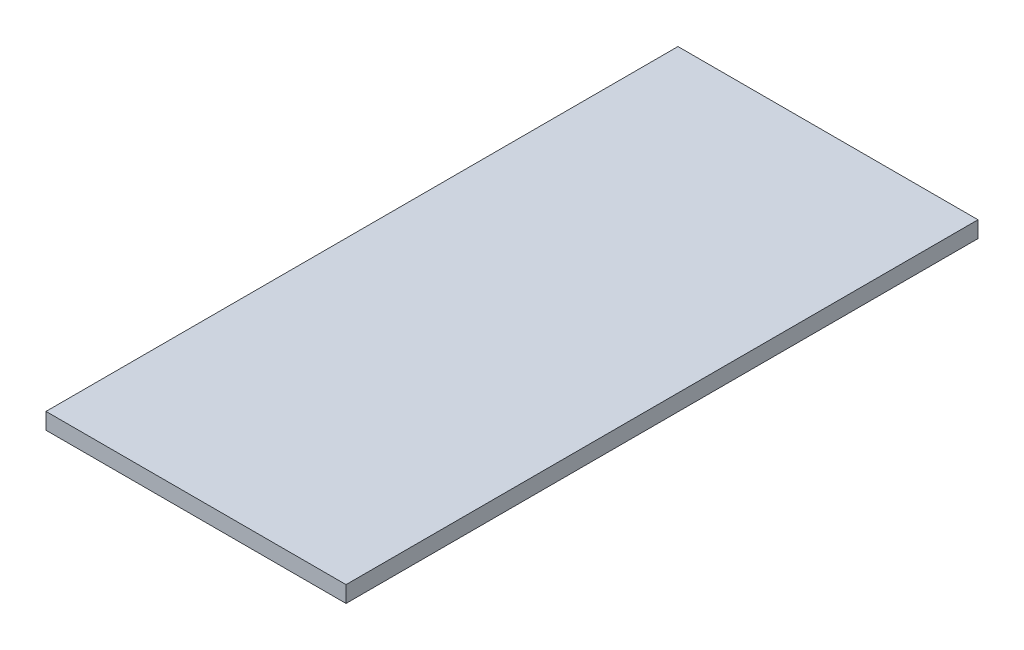
ISO-10303-21;
HEADER;
FILE_DESCRIPTION(('STEP AP214'),'2;1');
FILE_NAME('part.step','',(''),(''),'','','');
FILE_SCHEMA(('AUTOMOTIVE_DESIGN { 1 0 10303 214 1 1 1 1 }'));
ENDSEC;
DATA;
#1=APPLICATION_CONTEXT('core data for automotive mechanical design processes');
#2=APPLICATION_PROTOCOL_DEFINITION('international standard','automotive_design',2000,#1);
#3=PRODUCT_CONTEXT('',#1,'mechanical');
#4=PRODUCT('Part','Part','',(#3));
#5=PRODUCT_RELATED_PRODUCT_CATEGORY('part','',(#4));
#6=PRODUCT_DEFINITION_FORMATION('','',#4);
#7=PRODUCT_DEFINITION_CONTEXT('part definition',#1,'design');
#8=PRODUCT_DEFINITION('design','',#6,#7);
#9=PRODUCT_DEFINITION_SHAPE('','',#8);
#10=(LENGTH_UNIT() NAMED_UNIT(*) SI_UNIT(.MILLI.,.METRE.));
#11=(NAMED_UNIT(*) PLANE_ANGLE_UNIT() SI_UNIT($,.RADIAN.));
#12=(NAMED_UNIT(*) SI_UNIT($,.STERADIAN.) SOLID_ANGLE_UNIT());
#13=UNCERTAINTY_MEASURE_WITH_UNIT(LENGTH_MEASURE(1.E-05),#10,'distance_accuracy_value','');
#14=(GEOMETRIC_REPRESENTATION_CONTEXT(3) GLOBAL_UNCERTAINTY_ASSIGNED_CONTEXT((#13)) GLOBAL_UNIT_ASSIGNED_CONTEXT((#10,
#11,#12)) REPRESENTATION_CONTEXT('',''));
#15=CARTESIAN_POINT('',(0.,0.,0.));
#16=DIRECTION('',(0.,0.,1.));
#17=DIRECTION('',(1.,0.,0.));
#18=AXIS2_PLACEMENT_3D('',#15,#16,#17);
#19=CARTESIAN_POINT('',(1.4605,2.9956,-2.3241));
#20=DIRECTION('',(1.,0.,0.));
#21=DIRECTION('',(0.,-1.,0.));
#22=AXIS2_PLACEMENT_3D('',#19,#20,#21);
#23=PLANE('',#22);
#24=DIRECTION('',(0.,0.,1.));
#25=VECTOR('',#24,1.);
#26=CARTESIAN_POINT('',(1.4605,2.9306,-2.3241));
#27=LINE('',#26,#25);
#28=CARTESIAN_POINT('',(1.4605,2.9306,-4.8387));
#29=VERTEX_POINT('',#28);
#30=CARTESIAN_POINT('',(1.4605,2.9306,-2.3241));
#31=VERTEX_POINT('',#30);
#32=EDGE_CURVE('E11',#29,#31,#27,.T.);
#33=ORIENTED_EDGE('',*,*,#32,.T.);
#34=DIRECTION('',(0.,-1.,0.));
#35=VECTOR('',#34,1.);
#36=CARTESIAN_POINT('',(1.4605,2.9956,-2.3241));
#37=LINE('',#36,#35);
#38=CARTESIAN_POINT('',(1.4605,2.9956,-2.3241));
#39=VERTEX_POINT('',#38);
#40=EDGE_CURVE('E24',#39,#31,#37,.T.);
#41=ORIENTED_EDGE('',*,*,#40,.F.);
#42=DIRECTION('',(0.,0.,1.));
#43=VECTOR('',#42,1.);
#44=CARTESIAN_POINT('',(1.4605,2.9956,-2.3241));
#45=LINE('',#44,#43);
#46=CARTESIAN_POINT('',(1.4605,2.9956,-4.8387));
#47=VERTEX_POINT('',#46);
#48=EDGE_CURVE('E88',#47,#39,#45,.T.);
#49=ORIENTED_EDGE('',*,*,#48,.F.);
#50=DIRECTION('',(0.,-1.,0.));
#51=VECTOR('',#50,1.);
#52=CARTESIAN_POINT('',(1.4605,2.9956,-4.8387));
#53=LINE('',#52,#51);
#54=EDGE_CURVE('E77',#47,#29,#53,.T.);
#55=ORIENTED_EDGE('',*,*,#54,.T.);
#56=EDGE_LOOP('',(#33,#41,#49,#55));
#57=FACE_BOUND('',#56,.T.);
#58=ADVANCED_FACE('F17',(#57),#23,.F.);
#59=CARTESIAN_POINT('',(2.6543,2.9956,-2.3241));
#60=DIRECTION('',(0.,0.,-1.));
#61=DIRECTION('',(0.,1.,0.));
#62=AXIS2_PLACEMENT_3D('',#59,#60,#61);
#63=PLANE('',#62);
#64=DIRECTION('',(1.,0.,0.));
#65=VECTOR('',#64,1.);
#66=CARTESIAN_POINT('',(2.6543,2.9306,-2.3241));
#67=LINE('',#66,#65);
#68=CARTESIAN_POINT('',(2.6543,2.9306,-2.3241));
#69=VERTEX_POINT('',#68);
#70=EDGE_CURVE('E85',#31,#69,#67,.T.);
#71=ORIENTED_EDGE('',*,*,#70,.T.);
#72=DIRECTION('',(0.,-1.,0.));
#73=VECTOR('',#72,1.);
#74=CARTESIAN_POINT('',(2.6543,2.9956,-2.3241));
#75=LINE('',#74,#73);
#76=CARTESIAN_POINT('',(2.6543,2.9956,-2.3241));
#77=VERTEX_POINT('',#76);
#78=EDGE_CURVE('E83',#77,#69,#75,.T.);
#79=ORIENTED_EDGE('',*,*,#78,.F.);
#80=DIRECTION('',(1.,0.,0.));
#81=VECTOR('',#80,1.);
#82=CARTESIAN_POINT('',(2.6543,2.9956,-2.3241));
#83=LINE('',#82,#81);
#84=EDGE_CURVE('E72',#39,#77,#83,.T.);
#85=ORIENTED_EDGE('',*,*,#84,.F.);
#86=ORIENTED_EDGE('',*,*,#40,.T.);
#87=EDGE_LOOP('',(#71,#79,#85,#86));
#88=FACE_BOUND('',#87,.T.);
#89=ADVANCED_FACE('F90',(#88),#63,.F.);
#90=CARTESIAN_POINT('',(2.6543,2.9956,-4.8387));
#91=DIRECTION('',(-1.,0.,0.));
#92=DIRECTION('',(0.,1.,0.));
#93=AXIS2_PLACEMENT_3D('',#90,#91,#92);
#94=PLANE('',#93);
#95=DIRECTION('',(0.,0.,-1.));
#96=VECTOR('',#95,1.);
#97=CARTESIAN_POINT('',(2.6543,2.9306,-4.8387));
#98=LINE('',#97,#96);
#99=CARTESIAN_POINT('',(2.6543,2.9306,-4.8387));
#100=VERTEX_POINT('',#99);
#101=EDGE_CURVE('E60',#69,#100,#98,.T.);
#102=ORIENTED_EDGE('',*,*,#101,.T.);
#103=DIRECTION('',(0.,-1.,0.));
#104=VECTOR('',#103,1.);
#105=CARTESIAN_POINT('',(2.6543,2.9956,-4.8387));
#106=LINE('',#105,#104);
#107=CARTESIAN_POINT('',(2.6543,2.9956,-4.8387));
#108=VERTEX_POINT('',#107);
#109=EDGE_CURVE('E54',#108,#100,#106,.T.);
#110=ORIENTED_EDGE('',*,*,#109,.F.);
#111=DIRECTION('',(0.,0.,-1.));
#112=VECTOR('',#111,1.);
#113=CARTESIAN_POINT('',(2.6543,2.9956,-4.8387));
#114=LINE('',#113,#112);
#115=EDGE_CURVE('E58',#77,#108,#114,.T.);
#116=ORIENTED_EDGE('',*,*,#115,.F.);
#117=ORIENTED_EDGE('',*,*,#78,.T.);
#118=EDGE_LOOP('',(#102,#110,#116,#117));
#119=FACE_BOUND('',#118,.T.);
#120=ADVANCED_FACE('F56',(#119),#94,.F.);
#121=CARTESIAN_POINT('',(1.4605,2.9956,-4.8387));
#122=DIRECTION('',(0.,0.,1.));
#123=DIRECTION('',(0.,-1.,0.));
#124=AXIS2_PLACEMENT_3D('',#121,#122,#123);
#125=PLANE('',#124);
#126=DIRECTION('',(-1.,0.,0.));
#127=VECTOR('',#126,1.);
#128=CARTESIAN_POINT('',(1.4605,2.9306,-4.8387));
#129=LINE('',#128,#127);
#130=EDGE_CURVE('E73',#100,#29,#129,.T.);
#131=ORIENTED_EDGE('',*,*,#130,.T.);
#132=ORIENTED_EDGE('',*,*,#54,.F.);
#133=DIRECTION('',(-1.,0.,0.));
#134=VECTOR('',#133,1.);
#135=CARTESIAN_POINT('',(1.4605,2.9956,-4.8387));
#136=LINE('',#135,#134);
#137=EDGE_CURVE('E70',#108,#47,#136,.T.);
#138=ORIENTED_EDGE('',*,*,#137,.F.);
#139=ORIENTED_EDGE('',*,*,#109,.T.);
#140=EDGE_LOOP('',(#131,#132,#138,#139));
#141=FACE_BOUND('',#140,.T.);
#142=ADVANCED_FACE('F76',(#141),#125,.F.);
#143=CARTESIAN_POINT('',(0.,2.9956,0.));
#144=DIRECTION('',(0.,-1.,0.));
#145=DIRECTION('',(-1.,0.,0.));
#146=AXIS2_PLACEMENT_3D('',#143,#144,#145);
#147=PLANE('',#146);
#148=ORIENTED_EDGE('',*,*,#48,.T.);
#149=ORIENTED_EDGE('',*,*,#84,.T.);
#150=ORIENTED_EDGE('',*,*,#115,.T.);
#151=ORIENTED_EDGE('',*,*,#137,.T.);
#152=EDGE_LOOP('',(#148,#149,#150,#151));
#153=FACE_BOUND('',#152,.T.);
#154=ADVANCED_FACE('F69',(#153),#147,.F.);
#155=CARTESIAN_POINT('',(0.,2.9306,0.));
#156=DIRECTION('',(0.,-1.,0.));
#157=DIRECTION('',(-1.,0.,0.));
#158=AXIS2_PLACEMENT_3D('',#155,#156,#157);
#159=PLANE('',#158);
#160=ORIENTED_EDGE('',*,*,#32,.F.);
#161=ORIENTED_EDGE('',*,*,#130,.F.);
#162=ORIENTED_EDGE('',*,*,#101,.F.);
#163=ORIENTED_EDGE('',*,*,#70,.F.);
#164=EDGE_LOOP('',(#160,#161,#162,#163));
#165=FACE_BOUND('',#164,.T.);
#166=ADVANCED_FACE('F91',(#165),#159,.T.);
#167=CLOSED_SHELL('',(#58,#89,#120,#142,#154,#166));
#168=MANIFOLD_SOLID_BREP('B1',#167);
#169=ADVANCED_BREP_SHAPE_REPRESENTATION('',(#18,#168),#14);
#170=SHAPE_DEFINITION_REPRESENTATION(#9,#169);
ENDSEC;
END-ISO-10303-21;
